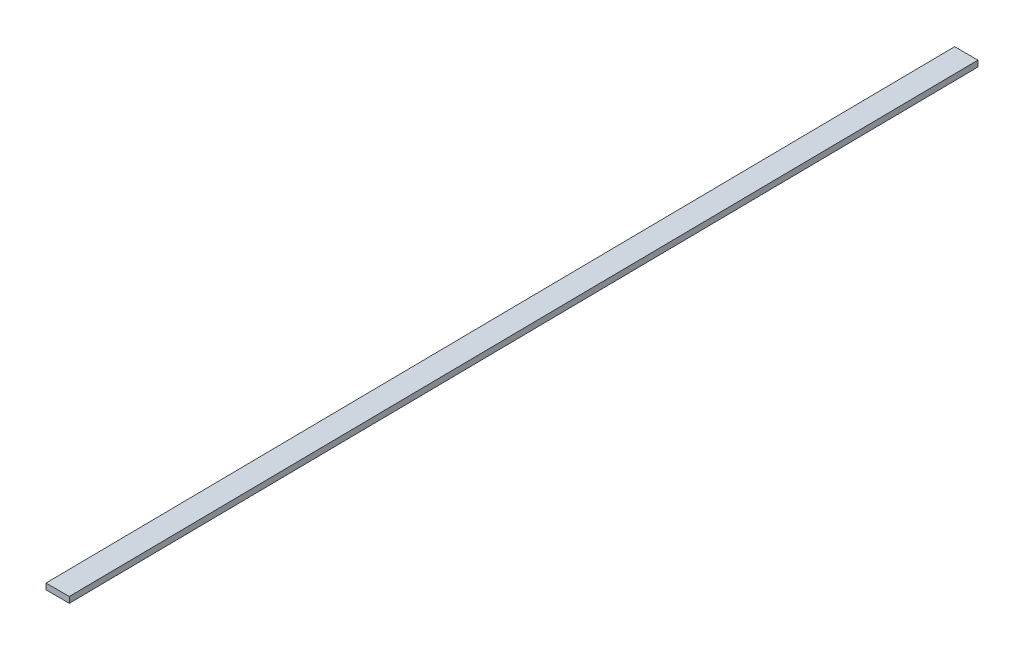
ISO-10303-21;
HEADER;
FILE_DESCRIPTION(('STEP AP214'),'2;1');
FILE_NAME('part.step','',(''),(''),'','','');
FILE_SCHEMA(('AUTOMOTIVE_DESIGN { 1 0 10303 214 1 1 1 1 }'));
ENDSEC;
DATA;
#1=APPLICATION_CONTEXT('core data for automotive mechanical design processes');
#2=APPLICATION_PROTOCOL_DEFINITION('international standard','automotive_design',2000,#1);
#3=PRODUCT_CONTEXT('',#1,'mechanical');
#4=PRODUCT('Part','Part','',(#3));
#5=PRODUCT_RELATED_PRODUCT_CATEGORY('part','',(#4));
#6=PRODUCT_DEFINITION_FORMATION('','',#4);
#7=PRODUCT_DEFINITION_CONTEXT('part definition',#1,'design');
#8=PRODUCT_DEFINITION('design','',#6,#7);
#9=PRODUCT_DEFINITION_SHAPE('','',#8);
#10=(LENGTH_UNIT() NAMED_UNIT(*) SI_UNIT(.MILLI.,.METRE.));
#11=(NAMED_UNIT(*) PLANE_ANGLE_UNIT() SI_UNIT($,.RADIAN.));
#12=(NAMED_UNIT(*) SI_UNIT($,.STERADIAN.) SOLID_ANGLE_UNIT());
#13=UNCERTAINTY_MEASURE_WITH_UNIT(LENGTH_MEASURE(1.E-05),#10,'distance_accuracy_value','');
#14=(GEOMETRIC_REPRESENTATION_CONTEXT(3) GLOBAL_UNCERTAINTY_ASSIGNED_CONTEXT((#13)) GLOBAL_UNIT_ASSIGNED_CONTEXT((#10,
#11,#12)) REPRESENTATION_CONTEXT('',''));
#15=CARTESIAN_POINT('',(0.,0.,0.));
#16=DIRECTION('',(0.,0.,1.));
#17=DIRECTION('',(1.,0.,0.));
#18=AXIS2_PLACEMENT_3D('',#15,#16,#17);
#19=CARTESIAN_POINT('',(257.051206630707,349.069511437359,1497.55289267231));
#20=DIRECTION('',(-1.,0.,0.));
#21=DIRECTION('',(0.,0.,1.));
#22=AXIS2_PLACEMENT_3D('',#19,#20,#21);
#23=PLANE('',#22);
#24=DIRECTION('',(0.,-0.0111918961883254,0.999937368768519));
#25=VECTOR('',#24,1.);
#26=CARTESIAN_POINT('',(257.051206630707,353.831713156119,1497.60619407791));
#27=LINE('',#26,#25);
#28=CARTESIAN_POINT('',(257.051206630713,361.898497769102,776.88119407791));
#29=VERTEX_POINT('',#28);
#30=CARTESIAN_POINT('',(257.051206630706,353.796176660027,1500.78119407791));
#31=VERTEX_POINT('',#30);
#32=EDGE_CURVE('E72',#29,#31,#27,.T.);
#33=ORIENTED_EDGE('',*,*,#32,.T.);
#34=DIRECTION('',(0.,0.999937368768519,0.0111918961883221));
#35=VECTOR('',#34,1.);
#36=CARTESIAN_POINT('',(257.051206630706,349.033974941267,1500.72789267231));
#37=LINE('',#36,#35);
#38=CARTESIAN_POINT('',(257.051206630706,349.033974941267,1500.72789267231));
#39=VERTEX_POINT('',#38);
#40=EDGE_CURVE('E11',#39,#31,#37,.T.);
#41=ORIENTED_EDGE('',*,*,#40,.F.);
#42=DIRECTION('',(0.,-0.0111918961883262,0.999937368768519));
#43=VECTOR('',#42,1.);
#44=CARTESIAN_POINT('',(257.051206630713,357.136296050342,776.827892672313));
#45=LINE('',#44,#43);
#46=CARTESIAN_POINT('',(257.051206630713,357.136296050342,776.827892672313));
#47=VERTEX_POINT('',#46);
#48=EDGE_CURVE('E77',#47,#39,#45,.T.);
#49=ORIENTED_EDGE('',*,*,#48,.F.);
#50=DIRECTION('',(0.,0.999937368768519,0.0111918961883221));
#51=VECTOR('',#50,1.);
#52=CARTESIAN_POINT('',(257.051206630713,357.136296050342,776.827892672313));
#53=LINE('',#52,#51);
#54=EDGE_CURVE('E93',#47,#29,#53,.T.);
#55=ORIENTED_EDGE('',*,*,#54,.T.);
#56=EDGE_LOOP('',(#33,#41,#49,#55));
#57=FACE_BOUND('',#56,.T.);
#58=ADVANCED_FACE('F33',(#57),#23,.F.);
#59=CARTESIAN_POINT('',(257.051206630706,349.033974941267,1500.72789267231));
#60=DIRECTION('',(0.,0.0111918961883221,-0.999937368768519));
#61=DIRECTION('',(0.,0.999937368768519,0.0111918961883221));
#62=AXIS2_PLACEMENT_3D('',#59,#60,#61);
#63=PLANE('',#62);
#64=DIRECTION('',(-1.,0.,0.));
#65=VECTOR('',#64,1.);
#66=CARTESIAN_POINT('',(257.051206630706,353.796176660027,1500.78119407791));
#67=LINE('',#66,#65);
#68=CARTESIAN_POINT('',(238.509206630706,353.796176660027,1500.78119407791));
#69=VERTEX_POINT('',#68);
#70=EDGE_CURVE('E89',#31,#69,#67,.T.);
#71=ORIENTED_EDGE('',*,*,#70,.T.);
#72=DIRECTION('',(0.,0.999937368768519,0.0111918961883221));
#73=VECTOR('',#72,1.);
#74=CARTESIAN_POINT('',(238.509206630706,349.033974941267,1500.72789267231));
#75=LINE('',#74,#73);
#76=CARTESIAN_POINT('',(238.509206630706,349.033974941267,1500.72789267231));
#77=VERTEX_POINT('',#76);
#78=EDGE_CURVE('E41',#77,#69,#75,.T.);
#79=ORIENTED_EDGE('',*,*,#78,.F.);
#80=DIRECTION('',(-1.,0.,0.));
#81=VECTOR('',#80,1.);
#82=CARTESIAN_POINT('',(257.051206630706,349.033974941267,1500.72789267231));
#83=LINE('',#82,#81);
#84=EDGE_CURVE('E80',#39,#77,#83,.T.);
#85=ORIENTED_EDGE('',*,*,#84,.F.);
#86=ORIENTED_EDGE('',*,*,#40,.T.);
#87=EDGE_LOOP('',(#71,#79,#85,#86));
#88=FACE_BOUND('',#87,.T.);
#89=ADVANCED_FACE('F88',(#88),#63,.F.);
#90=CARTESIAN_POINT('',(238.509206630713,357.10075955425,780.002892672313));
#91=DIRECTION('',(1.,0.,0.));
#92=DIRECTION('',(0.,0.,-1.));
#93=AXIS2_PLACEMENT_3D('',#90,#91,#92);
#94=PLANE('',#93);
#95=DIRECTION('',(0.,0.0111918961883262,-0.999937368768519));
#96=VECTOR('',#95,1.);
#97=CARTESIAN_POINT('',(238.509206630713,361.86296127301,780.05619407791));
#98=LINE('',#97,#96);
#99=CARTESIAN_POINT('',(238.509206630713,361.898497769102,776.88119407791));
#100=VERTEX_POINT('',#99);
#101=EDGE_CURVE('E65',#69,#100,#98,.T.);
#102=ORIENTED_EDGE('',*,*,#101,.T.);
#103=DIRECTION('',(0.,0.999937368768519,0.0111918961883221));
#104=VECTOR('',#103,1.);
#105=CARTESIAN_POINT('',(238.509206630713,357.136296050342,776.827892672313));
#106=LINE('',#105,#104);
#107=CARTESIAN_POINT('',(238.509206630713,357.136296050342,776.827892672313));
#108=VERTEX_POINT('',#107);
#109=EDGE_CURVE('E90',#108,#100,#106,.T.);
#110=ORIENTED_EDGE('',*,*,#109,.F.);
#111=DIRECTION('',(0.,0.0111918961883246,-0.999937368768519));
#112=VECTOR('',#111,1.);
#113=CARTESIAN_POINT('',(238.509206630706,349.033974941267,1500.72789267231));
#114=LINE('',#113,#112);
#115=EDGE_CURVE('E84',#77,#108,#114,.T.);
#116=ORIENTED_EDGE('',*,*,#115,.F.);
#117=ORIENTED_EDGE('',*,*,#78,.T.);
#118=EDGE_LOOP('',(#102,#110,#116,#117));
#119=FACE_BOUND('',#118,.T.);
#120=ADVANCED_FACE('F91',(#119),#94,.F.);
#121=CARTESIAN_POINT('',(238.509206630713,357.136296050342,776.827892672313));
#122=DIRECTION('',(0.,-0.0111918961883221,0.999937368768519));
#123=DIRECTION('',(0.,-0.999937368768519,-0.0111918961883221));
#124=AXIS2_PLACEMENT_3D('',#121,#122,#123);
#125=PLANE('',#124);
#126=DIRECTION('',(1.,0.,0.));
#127=VECTOR('',#126,1.);
#128=CARTESIAN_POINT('',(238.509206630713,361.898497769102,776.88119407791));
#129=LINE('',#128,#127);
#130=EDGE_CURVE('E100',#100,#29,#129,.T.);
#131=ORIENTED_EDGE('',*,*,#130,.T.);
#132=ORIENTED_EDGE('',*,*,#54,.F.);
#133=DIRECTION('',(1.,0.,0.));
#134=VECTOR('',#133,1.);
#135=CARTESIAN_POINT('',(238.509206630713,357.136296050342,776.827892672313));
#136=LINE('',#135,#134);
#137=EDGE_CURVE('E49',#108,#47,#136,.T.);
#138=ORIENTED_EDGE('',*,*,#137,.F.);
#139=ORIENTED_EDGE('',*,*,#109,.T.);
#140=EDGE_LOOP('',(#131,#132,#138,#139));
#141=FACE_BOUND('',#140,.T.);
#142=ADVANCED_FACE('F105',(#141),#125,.F.);
#143=CARTESIAN_POINT('',(0.,365.785194283182,4.09408633931333));
#144=DIRECTION('',(0.,-0.999937368768519,-0.0111918961883262));
#145=DIRECTION('',(0.,0.0111918961883262,-0.999937368768519));
#146=AXIS2_PLACEMENT_3D('',#143,#144,#145);
#147=PLANE('',#146);
#148=ORIENTED_EDGE('',*,*,#48,.T.);
#149=ORIENTED_EDGE('',*,*,#84,.T.);
#150=ORIENTED_EDGE('',*,*,#115,.T.);
#151=ORIENTED_EDGE('',*,*,#137,.T.);
#152=EDGE_LOOP('',(#148,#149,#150,#151));
#153=FACE_BOUND('',#152,.T.);
#154=ADVANCED_FACE('F82',(#153),#147,.T.);
#155=CARTESIAN_POINT('',(0.,370.547396001942,4.14738774491021));
#156=DIRECTION('',(0.,-0.999937368768519,-0.0111918961883262));
#157=DIRECTION('',(0.,0.0111918961883262,-0.999937368768519));
#158=AXIS2_PLACEMENT_3D('',#155,#156,#157);
#159=PLANE('',#158);
#160=ORIENTED_EDGE('',*,*,#32,.F.);
#161=ORIENTED_EDGE('',*,*,#130,.F.);
#162=ORIENTED_EDGE('',*,*,#101,.F.);
#163=ORIENTED_EDGE('',*,*,#70,.F.);
#164=EDGE_LOOP('',(#160,#161,#162,#163));
#165=FACE_BOUND('',#164,.T.);
#166=ADVANCED_FACE('F106',(#165),#159,.F.);
#167=CLOSED_SHELL('',(#58,#89,#120,#142,#154,#166));
#168=MANIFOLD_SOLID_BREP('B2',#167);
#169=ADVANCED_BREP_SHAPE_REPRESENTATION('',(#18,#168),#14);
#170=SHAPE_DEFINITION_REPRESENTATION(#9,#169);
ENDSEC;
END-ISO-10303-21;
